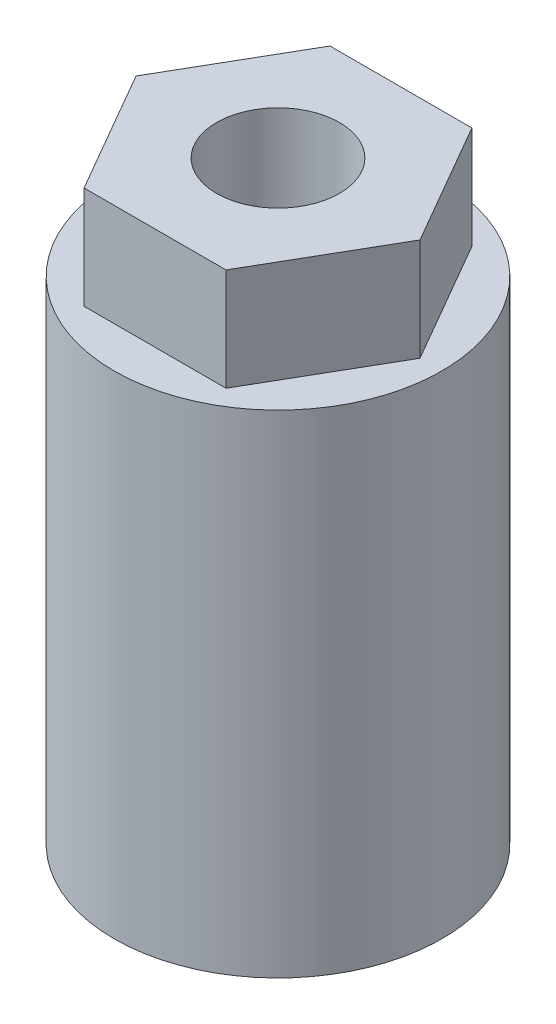
ISO-10303-21;
HEADER;
FILE_DESCRIPTION(('STEP AP214'),'2;1');
FILE_NAME('part.step','',(''),(''),'','','');
FILE_SCHEMA(('AUTOMOTIVE_DESIGN { 1 0 10303 214 1 1 1 1 }'));
ENDSEC;
DATA;
#1=APPLICATION_CONTEXT('core data for automotive mechanical design processes');
#2=APPLICATION_PROTOCOL_DEFINITION('international standard','automotive_design',2000,#1);
#3=PRODUCT_CONTEXT('',#1,'mechanical');
#4=PRODUCT('Part','Part','',(#3));
#5=PRODUCT_RELATED_PRODUCT_CATEGORY('part','',(#4));
#6=PRODUCT_DEFINITION_FORMATION('','',#4);
#7=PRODUCT_DEFINITION_CONTEXT('part definition',#1,'design');
#8=PRODUCT_DEFINITION('design','',#6,#7);
#9=PRODUCT_DEFINITION_SHAPE('','',#8);
#10=(LENGTH_UNIT() NAMED_UNIT(*) SI_UNIT(.MILLI.,.METRE.));
#11=(NAMED_UNIT(*) PLANE_ANGLE_UNIT() SI_UNIT($,.RADIAN.));
#12=(NAMED_UNIT(*) SI_UNIT($,.STERADIAN.) SOLID_ANGLE_UNIT());
#13=UNCERTAINTY_MEASURE_WITH_UNIT(LENGTH_MEASURE(1.E-05),#10,'distance_accuracy_value','');
#14=(GEOMETRIC_REPRESENTATION_CONTEXT(3) GLOBAL_UNCERTAINTY_ASSIGNED_CONTEXT((#13)) GLOBAL_UNIT_ASSIGNED_CONTEXT((#10,
#11,#12)) REPRESENTATION_CONTEXT('',''));
#15=CARTESIAN_POINT('',(0.,0.,0.));
#16=DIRECTION('',(0.,0.,1.));
#17=DIRECTION('',(1.,0.,0.));
#18=AXIS2_PLACEMENT_3D('',#15,#16,#17);
#19=CARTESIAN_POINT('',(0.,0.,0.));
#20=DIRECTION('',(0.,-1.,0.));
#21=DIRECTION('',(0.,0.,-1.));
#22=AXIS2_PLACEMENT_3D('',#19,#20,#21);
#23=CYLINDRICAL_SURFACE('',#22,4.3);
#24=CARTESIAN_POINT('',(0.,0.,0.));
#25=DIRECTION('',(0.,-1.,0.));
#26=DIRECTION('',(0.,0.,-1.));
#27=AXIS2_PLACEMENT_3D('',#24,#25,#26);
#28=CIRCLE('',#27,4.3);
#29=CARTESIAN_POINT('',(3.92778563569857,0.,1.75));
#30=VERTEX_POINT('',#29);
#31=CARTESIAN_POINT('',(3.92778563569857,0.,-1.75));
#32=VERTEX_POINT('',#31);
#33=EDGE_CURVE('E11',#30,#32,#28,.T.);
#34=ORIENTED_EDGE('',*,*,#33,.T.);
#35=DIRECTION('',(0.,-1.,0.));
#36=VECTOR('',#35,1.);
#37=CARTESIAN_POINT('',(3.92778563569857,0.,-1.75));
#38=LINE('',#37,#36);
#39=CARTESIAN_POINT('',(3.92778563569857,12.,-1.75));
#40=VERTEX_POINT('',#39);
#41=EDGE_CURVE('E126',#32,#40,#38,.F.);
#42=ORIENTED_EDGE('',*,*,#41,.T.);
#43=CARTESIAN_POINT('',(0.,12.,0.));
#44=DIRECTION('',(0.,-1.,0.));
#45=DIRECTION('',(0.,0.,-1.));
#46=AXIS2_PLACEMENT_3D('',#43,#44,#45);
#47=CIRCLE('',#46,4.3);
#48=CARTESIAN_POINT('',(3.92778563569857,12.,1.75));
#49=VERTEX_POINT('',#48);
#50=EDGE_CURVE('E205',#49,#40,#47,.T.);
#51=ORIENTED_EDGE('',*,*,#50,.F.);
#52=DIRECTION('',(0.,-1.,0.));
#53=VECTOR('',#52,1.);
#54=CARTESIAN_POINT('',(3.92778563569857,0.,1.75));
#55=LINE('',#54,#53);
#56=EDGE_CURVE('E149',#49,#30,#55,.T.);
#57=ORIENTED_EDGE('',*,*,#56,.T.);
#58=EDGE_LOOP('',(#34,#42,#51,#57));
#59=FACE_BOUND('',#58,.T.);
#60=ADVANCED_FACE('F41',(#59),#23,.F.);
#61=CARTESIAN_POINT('',(0.,0.,0.));
#62=DIRECTION('',(0.,-1.,0.));
#63=DIRECTION('',(0.,0.,-1.));
#64=AXIS2_PLACEMENT_3D('',#61,#62,#63);
#65=PLANE('',#64);
#66=DIRECTION('',(1.,0.,0.));
#67=VECTOR('',#66,1.);
#68=CARTESIAN_POINT('',(2.55,0.,-1.75));
#69=LINE('',#68,#67);
#70=CARTESIAN_POINT('',(6.05,0.,-1.75));
#71=VERTEX_POINT('',#70);
#72=EDGE_CURVE('E122',#32,#71,#69,.T.);
#73=ORIENTED_EDGE('',*,*,#72,.F.);
#74=ORIENTED_EDGE('',*,*,#33,.F.);
#75=DIRECTION('',(-1.,0.,0.));
#76=VECTOR('',#75,1.);
#77=CARTESIAN_POINT('',(2.55,0.,1.75));
#78=LINE('',#77,#76);
#79=CARTESIAN_POINT('',(6.05,0.,1.75));
#80=VERTEX_POINT('',#79);
#81=EDGE_CURVE('E130',#80,#30,#78,.T.);
#82=ORIENTED_EDGE('',*,*,#81,.F.);
#83=DIRECTION('',(0.,0.,1.));
#84=VECTOR('',#83,1.);
#85=CARTESIAN_POINT('',(6.05,0.,-1.75));
#86=LINE('',#85,#84);
#87=EDGE_CURVE('E55',#71,#80,#86,.T.);
#88=ORIENTED_EDGE('',*,*,#87,.F.);
#89=EDGE_LOOP('',(#73,#74,#82,#88));
#90=FACE_BOUND('',#89,.T.);
#91=CARTESIAN_POINT('',(0.,0.,0.));
#92=DIRECTION('',(0.,-1.,0.));
#93=DIRECTION('',(0.,0.,-1.));
#94=AXIS2_PLACEMENT_3D('',#91,#92,#93);
#95=CIRCLE('',#94,8.);
#96=CARTESIAN_POINT('',(0.,0.,-8.));
#97=VERTEX_POINT('',#96);
#98=EDGE_CURVE('E48',#97,#97,#95,.T.);
#99=ORIENTED_EDGE('',*,*,#98,.T.);
#100=EDGE_LOOP('',(#99));
#101=FACE_BOUND('',#100,.T.);
#102=ADVANCED_FACE('F139',(#90,#101),#65,.T.);
#103=CARTESIAN_POINT('',(0.,0.,0.));
#104=DIRECTION('',(0.,-1.,0.));
#105=DIRECTION('',(0.,0.,-1.));
#106=AXIS2_PLACEMENT_3D('',#103,#104,#105);
#107=CYLINDRICAL_SURFACE('',#106,8.);
#108=CARTESIAN_POINT('',(0.,24.,0.));
#109=DIRECTION('',(0.,-1.,0.));
#110=DIRECTION('',(0.,0.,-1.));
#111=AXIS2_PLACEMENT_3D('',#108,#109,#110);
#112=CIRCLE('',#111,8.);
#113=CARTESIAN_POINT('',(0.,24.,-8.));
#114=VERTEX_POINT('',#113);
#115=EDGE_CURVE('E208',#114,#114,#112,.T.);
#116=ORIENTED_EDGE('',*,*,#115,.T.);
#117=EDGE_LOOP('',(#116));
#118=FACE_BOUND('',#117,.T.);
#119=ORIENTED_EDGE('',*,*,#98,.F.);
#120=EDGE_LOOP('',(#119));
#121=FACE_BOUND('',#120,.T.);
#122=ADVANCED_FACE('F213',(#118,#121),#107,.T.);
#123=CARTESIAN_POINT('',(0.,24.,0.));
#124=DIRECTION('',(0.,1.,0.));
#125=DIRECTION('',(0.,0.,1.));
#126=AXIS2_PLACEMENT_3D('',#123,#124,#125);
#127=PLANE('',#126);
#128=DIRECTION('',(0.5,0.,-0.866025403784439));
#129=VECTOR('',#128,1.);
#130=CARTESIAN_POINT('',(3.46410161513775,24.,6.));
#131=LINE('',#130,#129);
#132=CARTESIAN_POINT('',(3.46410161513775,24.,6.));
#133=VERTEX_POINT('',#132);
#134=CARTESIAN_POINT('',(6.92820323027551,24.,0.));
#135=VERTEX_POINT('',#134);
#136=EDGE_CURVE('E63',#133,#135,#131,.T.);
#137=ORIENTED_EDGE('',*,*,#136,.F.);
#138=DIRECTION('',(1.,0.,0.));
#139=VECTOR('',#138,1.);
#140=CARTESIAN_POINT('',(-3.46410161513775,24.,6.));
#141=LINE('',#140,#139);
#142=CARTESIAN_POINT('',(-3.46410161513775,24.,6.));
#143=VERTEX_POINT('',#142);
#144=EDGE_CURVE('E163',#143,#133,#141,.T.);
#145=ORIENTED_EDGE('',*,*,#144,.F.);
#146=DIRECTION('',(0.5,0.,0.866025403784439));
#147=VECTOR('',#146,1.);
#148=CARTESIAN_POINT('',(-6.92820323027551,24.,0.));
#149=LINE('',#148,#147);
#150=CARTESIAN_POINT('',(-6.92820323027551,24.,0.));
#151=VERTEX_POINT('',#150);
#152=EDGE_CURVE('E184',#151,#143,#149,.T.);
#153=ORIENTED_EDGE('',*,*,#152,.F.);
#154=DIRECTION('',(-0.5,0.,0.866025403784439));
#155=VECTOR('',#154,1.);
#156=CARTESIAN_POINT('',(-3.46410161513775,24.,-6.));
#157=LINE('',#156,#155);
#158=CARTESIAN_POINT('',(-3.46410161513775,24.,-6.));
#159=VERTEX_POINT('',#158);
#160=EDGE_CURVE('E181',#159,#151,#157,.T.);
#161=ORIENTED_EDGE('',*,*,#160,.F.);
#162=DIRECTION('',(-1.,0.,0.));
#163=VECTOR('',#162,1.);
#164=CARTESIAN_POINT('',(3.46410161513775,24.,-6.));
#165=LINE('',#164,#163);
#166=CARTESIAN_POINT('',(3.46410161513775,24.,-6.));
#167=VERTEX_POINT('',#166);
#168=EDGE_CURVE('E178',#167,#159,#165,.T.);
#169=ORIENTED_EDGE('',*,*,#168,.F.);
#170=DIRECTION('',(-0.5,0.,-0.866025403784439));
#171=VECTOR('',#170,1.);
#172=CARTESIAN_POINT('',(6.92820323027551,24.,0.));
#173=LINE('',#172,#171);
#174=EDGE_CURVE('E175',#135,#167,#173,.T.);
#175=ORIENTED_EDGE('',*,*,#174,.F.);
#176=EDGE_LOOP('',(#137,#145,#153,#161,#169,#175));
#177=FACE_BOUND('',#176,.T.);
#178=ORIENTED_EDGE('',*,*,#115,.F.);
#179=EDGE_LOOP('',(#178));
#180=FACE_BOUND('',#179,.T.);
#181=ADVANCED_FACE('F215',(#177,#180),#127,.T.);
#182=CARTESIAN_POINT('',(0.,12.,0.));
#183=DIRECTION('',(0.,-1.,0.));
#184=DIRECTION('',(0.,0.,-1.));
#185=AXIS2_PLACEMENT_3D('',#182,#183,#184);
#186=PLANE('',#185);
#187=ORIENTED_EDGE('',*,*,#50,.T.);
#188=DIRECTION('',(-1.,0.,0.));
#189=VECTOR('',#188,1.);
#190=CARTESIAN_POINT('',(2.55,12.,-1.75));
#191=LINE('',#190,#189);
#192=CARTESIAN_POINT('',(6.05,12.,-1.75));
#193=VERTEX_POINT('',#192);
#194=EDGE_CURVE('E136',#193,#40,#191,.T.);
#195=ORIENTED_EDGE('',*,*,#194,.F.);
#196=DIRECTION('',(0.,0.,-1.));
#197=VECTOR('',#196,1.);
#198=CARTESIAN_POINT('',(6.05,12.,-1.75));
#199=LINE('',#198,#197);
#200=CARTESIAN_POINT('',(6.05,12.,1.75));
#201=VERTEX_POINT('',#200);
#202=EDGE_CURVE('E134',#201,#193,#199,.T.);
#203=ORIENTED_EDGE('',*,*,#202,.F.);
#204=DIRECTION('',(1.,0.,0.));
#205=VECTOR('',#204,1.);
#206=CARTESIAN_POINT('',(2.55,12.,1.75));
#207=LINE('',#206,#205);
#208=EDGE_CURVE('E147',#49,#201,#207,.T.);
#209=ORIENTED_EDGE('',*,*,#208,.F.);
#210=EDGE_LOOP('',(#187,#195,#203,#209));
#211=FACE_BOUND('',#210,.T.);
#212=ADVANCED_FACE('F222',(#211),#186,.T.);
#213=CARTESIAN_POINT('',(3.46410161513775,29.,6.));
#214=DIRECTION('',(-0.866025403784439,0.,-0.5));
#215=DIRECTION('',(-0.5,0.,0.866025403784439));
#216=AXIS2_PLACEMENT_3D('',#213,#214,#215);
#217=PLANE('',#216);
#218=ORIENTED_EDGE('',*,*,#136,.T.);
#219=DIRECTION('',(0.,-1.,0.));
#220=VECTOR('',#219,1.);
#221=CARTESIAN_POINT('',(6.92820323027551,29.,0.));
#222=LINE('',#221,#220);
#223=CARTESIAN_POINT('',(6.92820323027551,29.,0.));
#224=VERTEX_POINT('',#223);
#225=EDGE_CURVE('E202',#224,#135,#222,.T.);
#226=ORIENTED_EDGE('',*,*,#225,.F.);
#227=DIRECTION('',(0.5,0.,-0.866025403784439));
#228=VECTOR('',#227,1.);
#229=CARTESIAN_POINT('',(3.46410161513775,29.,6.));
#230=LINE('',#229,#228);
#231=CARTESIAN_POINT('',(3.46410161513775,29.,6.));
#232=VERTEX_POINT('',#231);
#233=EDGE_CURVE('E159',#232,#224,#230,.T.);
#234=ORIENTED_EDGE('',*,*,#233,.F.);
#235=DIRECTION('',(0.,-1.,0.));
#236=VECTOR('',#235,1.);
#237=CARTESIAN_POINT('',(3.46410161513775,29.,6.));
#238=LINE('',#237,#236);
#239=EDGE_CURVE('E173',#232,#133,#238,.T.);
#240=ORIENTED_EDGE('',*,*,#239,.T.);
#241=EDGE_LOOP('',(#218,#226,#234,#240));
#242=FACE_BOUND('',#241,.T.);
#243=ADVANCED_FACE('F234',(#242),#217,.F.);
#244=CARTESIAN_POINT('',(6.92820323027551,29.,0.));
#245=DIRECTION('',(-0.866025403784439,0.,0.5));
#246=DIRECTION('',(0.5,0.,0.866025403784439));
#247=AXIS2_PLACEMENT_3D('',#244,#245,#246);
#248=PLANE('',#247);
#249=ORIENTED_EDGE('',*,*,#174,.T.);
#250=DIRECTION('',(0.,-1.,0.));
#251=VECTOR('',#250,1.);
#252=CARTESIAN_POINT('',(3.46410161513775,29.,-6.));
#253=LINE('',#252,#251);
#254=CARTESIAN_POINT('',(3.46410161513775,29.,-6.));
#255=VERTEX_POINT('',#254);
#256=EDGE_CURVE('E199',#255,#167,#253,.T.);
#257=ORIENTED_EDGE('',*,*,#256,.F.);
#258=DIRECTION('',(-0.5,0.,-0.866025403784439));
#259=VECTOR('',#258,1.);
#260=CARTESIAN_POINT('',(6.92820323027551,29.,0.));
#261=LINE('',#260,#259);
#262=EDGE_CURVE('E162',#224,#255,#261,.T.);
#263=ORIENTED_EDGE('',*,*,#262,.F.);
#264=ORIENTED_EDGE('',*,*,#225,.T.);
#265=EDGE_LOOP('',(#249,#257,#263,#264));
#266=FACE_BOUND('',#265,.T.);
#267=ADVANCED_FACE('F239',(#266),#248,.F.);
#268=CARTESIAN_POINT('',(3.46410161513775,29.,-6.));
#269=DIRECTION('',(0.,0.,1.));
#270=DIRECTION('',(1.,0.,0.));
#271=AXIS2_PLACEMENT_3D('',#268,#269,#270);
#272=PLANE('',#271);
#273=ORIENTED_EDGE('',*,*,#168,.T.);
#274=DIRECTION('',(0.,-1.,0.));
#275=VECTOR('',#274,1.);
#276=CARTESIAN_POINT('',(-3.46410161513775,29.,-6.));
#277=LINE('',#276,#275);
#278=CARTESIAN_POINT('',(-3.46410161513775,29.,-6.));
#279=VERTEX_POINT('',#278);
#280=EDGE_CURVE('E196',#279,#159,#277,.T.);
#281=ORIENTED_EDGE('',*,*,#280,.F.);
#282=DIRECTION('',(-1.,0.,0.));
#283=VECTOR('',#282,1.);
#284=CARTESIAN_POINT('',(3.46410161513775,29.,-6.));
#285=LINE('',#284,#283);
#286=EDGE_CURVE('E165',#255,#279,#285,.T.);
#287=ORIENTED_EDGE('',*,*,#286,.F.);
#288=ORIENTED_EDGE('',*,*,#256,.T.);
#289=EDGE_LOOP('',(#273,#281,#287,#288));
#290=FACE_BOUND('',#289,.T.);
#291=ADVANCED_FACE('F245',(#290),#272,.F.);
#292=CARTESIAN_POINT('',(-3.46410161513775,29.,-6.));
#293=DIRECTION('',(0.866025403784439,0.,0.5));
#294=DIRECTION('',(0.5,0.,-0.866025403784439));
#295=AXIS2_PLACEMENT_3D('',#292,#293,#294);
#296=PLANE('',#295);
#297=ORIENTED_EDGE('',*,*,#160,.T.);
#298=DIRECTION('',(0.,-1.,0.));
#299=VECTOR('',#298,1.);
#300=CARTESIAN_POINT('',(-6.92820323027551,29.,0.));
#301=LINE('',#300,#299);
#302=CARTESIAN_POINT('',(-6.92820323027551,29.,0.));
#303=VERTEX_POINT('',#302);
#304=EDGE_CURVE('E193',#303,#151,#301,.T.);
#305=ORIENTED_EDGE('',*,*,#304,.F.);
#306=DIRECTION('',(-0.5,0.,0.866025403784439));
#307=VECTOR('',#306,1.);
#308=CARTESIAN_POINT('',(-3.46410161513775,29.,-6.));
#309=LINE('',#308,#307);
#310=EDGE_CURVE('E167',#279,#303,#309,.T.);
#311=ORIENTED_EDGE('',*,*,#310,.F.);
#312=ORIENTED_EDGE('',*,*,#280,.T.);
#313=EDGE_LOOP('',(#297,#305,#311,#312));
#314=FACE_BOUND('',#313,.T.);
#315=ADVANCED_FACE('F249',(#314),#296,.F.);
#316=CARTESIAN_POINT('',(-6.92820323027551,29.,0.));
#317=DIRECTION('',(0.866025403784439,0.,-0.5));
#318=DIRECTION('',(-0.5,0.,-0.866025403784439));
#319=AXIS2_PLACEMENT_3D('',#316,#317,#318);
#320=PLANE('',#319);
#321=ORIENTED_EDGE('',*,*,#152,.T.);
#322=DIRECTION('',(0.,-1.,0.));
#323=VECTOR('',#322,1.);
#324=CARTESIAN_POINT('',(-3.46410161513775,29.,6.));
#325=LINE('',#324,#323);
#326=CARTESIAN_POINT('',(-3.46410161513775,29.,6.));
#327=VERTEX_POINT('',#326);
#328=EDGE_CURVE('E190',#327,#143,#325,.T.);
#329=ORIENTED_EDGE('',*,*,#328,.F.);
#330=DIRECTION('',(0.5,0.,0.866025403784439));
#331=VECTOR('',#330,1.);
#332=CARTESIAN_POINT('',(-6.92820323027551,29.,0.));
#333=LINE('',#332,#331);
#334=EDGE_CURVE('E169',#303,#327,#333,.T.);
#335=ORIENTED_EDGE('',*,*,#334,.F.);
#336=ORIENTED_EDGE('',*,*,#304,.T.);
#337=EDGE_LOOP('',(#321,#329,#335,#336));
#338=FACE_BOUND('',#337,.T.);
#339=ADVANCED_FACE('F253',(#338),#320,.F.);
#340=CARTESIAN_POINT('',(-3.46410161513775,29.,6.));
#341=DIRECTION('',(0.,0.,-1.));
#342=DIRECTION('',(-1.,0.,0.));
#343=AXIS2_PLACEMENT_3D('',#340,#341,#342);
#344=PLANE('',#343);
#345=ORIENTED_EDGE('',*,*,#144,.T.);
#346=ORIENTED_EDGE('',*,*,#239,.F.);
#347=DIRECTION('',(1.,0.,0.));
#348=VECTOR('',#347,1.);
#349=CARTESIAN_POINT('',(-3.46410161513775,29.,6.));
#350=LINE('',#349,#348);
#351=EDGE_CURVE('E171',#327,#232,#350,.T.);
#352=ORIENTED_EDGE('',*,*,#351,.F.);
#353=ORIENTED_EDGE('',*,*,#328,.T.);
#354=EDGE_LOOP('',(#345,#346,#352,#353));
#355=FACE_BOUND('',#354,.T.);
#356=ADVANCED_FACE('F257',(#355),#344,.F.);
#357=CARTESIAN_POINT('',(0.,29.,0.));
#358=DIRECTION('',(0.,1.,0.));
#359=DIRECTION('',(0.,0.,1.));
#360=AXIS2_PLACEMENT_3D('',#357,#358,#359);
#361=PLANE('',#360);
#362=CARTESIAN_POINT('',(0.,29.,0.));
#363=DIRECTION('',(0.,1.,0.));
#364=DIRECTION('',(0.,0.,1.));
#365=AXIS2_PLACEMENT_3D('',#362,#363,#364);
#366=CIRCLE('',#365,3.);
#367=CARTESIAN_POINT('',(0.,29.,3.));
#368=VERTEX_POINT('',#367);
#369=EDGE_CURVE('E153',#368,#368,#366,.T.);
#370=ORIENTED_EDGE('',*,*,#369,.F.);
#371=EDGE_LOOP('',(#370));
#372=FACE_BOUND('',#371,.T.);
#373=ORIENTED_EDGE('',*,*,#233,.T.);
#374=ORIENTED_EDGE('',*,*,#262,.T.);
#375=ORIENTED_EDGE('',*,*,#286,.T.);
#376=ORIENTED_EDGE('',*,*,#310,.T.);
#377=ORIENTED_EDGE('',*,*,#334,.T.);
#378=ORIENTED_EDGE('',*,*,#351,.T.);
#379=EDGE_LOOP('',(#373,#374,#375,#376,#377,#378));
#380=FACE_BOUND('',#379,.T.);
#381=ADVANCED_FACE('F261',(#372,#380),#361,.T.);
#382=CARTESIAN_POINT('',(0.,19.,0.));
#383=DIRECTION('',(0.,1.,0.));
#384=DIRECTION('',(0.,0.,1.));
#385=AXIS2_PLACEMENT_3D('',#382,#383,#384);
#386=CONICAL_SURFACE('',#385,3.,1.02974425867665);
#387=CARTESIAN_POINT('',(0.,17.1974181429173,0.));
#388=VERTEX_POINT('',#387);
#389=VERTEX_LOOP('',#388);
#390=FACE_BOUND('',#389,.T.);
#391=CARTESIAN_POINT('',(0.,19.,0.));
#392=DIRECTION('',(0.,1.,0.));
#393=DIRECTION('',(0.,0.,1.));
#394=AXIS2_PLACEMENT_3D('',#391,#392,#393);
#395=CIRCLE('',#394,3.);
#396=CARTESIAN_POINT('',(0.,19.,3.));
#397=VERTEX_POINT('',#396);
#398=EDGE_CURVE('E156',#397,#397,#395,.T.);
#399=ORIENTED_EDGE('',*,*,#398,.T.);
#400=EDGE_LOOP('',(#399));
#401=FACE_BOUND('',#400,.T.);
#402=ADVANCED_FACE('F265',(#390,#401),#386,.F.);
#403=CARTESIAN_POINT('',(0.,29.,0.));
#404=DIRECTION('',(0.,1.,0.));
#405=DIRECTION('',(0.,0.,1.));
#406=AXIS2_PLACEMENT_3D('',#403,#404,#405);
#407=CYLINDRICAL_SURFACE('',#406,3.);
#408=ORIENTED_EDGE('',*,*,#398,.F.);
#409=EDGE_LOOP('',(#408));
#410=FACE_BOUND('',#409,.T.);
#411=ORIENTED_EDGE('',*,*,#369,.T.);
#412=EDGE_LOOP('',(#411));
#413=FACE_BOUND('',#412,.T.);
#414=ADVANCED_FACE('F269',(#410,#413),#407,.F.);
#415=CARTESIAN_POINT('',(2.55,16.9497474683058,-1.75));
#416=DIRECTION('',(0.,0.,-1.));
#417=DIRECTION('',(-1.,0.,0.));
#418=AXIS2_PLACEMENT_3D('',#415,#416,#417);
#419=PLANE('',#418);
#420=ORIENTED_EDGE('',*,*,#72,.T.);
#421=DIRECTION('',(0.,-1.,0.));
#422=VECTOR('',#421,1.);
#423=CARTESIAN_POINT('',(6.05,16.9497474683058,-1.75));
#424=LINE('',#423,#422);
#425=EDGE_CURVE('E124',#193,#71,#424,.T.);
#426=ORIENTED_EDGE('',*,*,#425,.F.);
#427=ORIENTED_EDGE('',*,*,#194,.T.);
#428=ORIENTED_EDGE('',*,*,#41,.F.);
#429=EDGE_LOOP('',(#420,#426,#427,#428));
#430=FACE_BOUND('',#429,.T.);
#431=ADVANCED_FACE('F123',(#430),#419,.F.);
#432=CARTESIAN_POINT('',(2.55,16.9497474683058,1.75));
#433=DIRECTION('',(0.,0.,1.));
#434=DIRECTION('',(1.,0.,0.));
#435=AXIS2_PLACEMENT_3D('',#432,#433,#434);
#436=PLANE('',#435);
#437=ORIENTED_EDGE('',*,*,#208,.T.);
#438=DIRECTION('',(0.,-1.,0.));
#439=VECTOR('',#438,1.);
#440=CARTESIAN_POINT('',(6.05,16.9497474683058,1.75));
#441=LINE('',#440,#439);
#442=EDGE_CURVE('E129',#201,#80,#441,.T.);
#443=ORIENTED_EDGE('',*,*,#442,.T.);
#444=ORIENTED_EDGE('',*,*,#81,.T.);
#445=ORIENTED_EDGE('',*,*,#56,.F.);
#446=EDGE_LOOP('',(#437,#443,#444,#445));
#447=FACE_BOUND('',#446,.T.);
#448=ADVANCED_FACE('F231',(#447),#436,.F.);
#449=CARTESIAN_POINT('',(6.05,16.9497474683058,-1.75));
#450=DIRECTION('',(1.,0.,0.));
#451=DIRECTION('',(0.,0.,-1.));
#452=AXIS2_PLACEMENT_3D('',#449,#450,#451);
#453=PLANE('',#452);
#454=ORIENTED_EDGE('',*,*,#202,.T.);
#455=ORIENTED_EDGE('',*,*,#425,.T.);
#456=ORIENTED_EDGE('',*,*,#87,.T.);
#457=ORIENTED_EDGE('',*,*,#442,.F.);
#458=EDGE_LOOP('',(#454,#455,#456,#457));
#459=FACE_BOUND('',#458,.T.);
#460=ADVANCED_FACE('F132',(#459),#453,.F.);
#461=CLOSED_SHELL('',(#60,#102,#122,#181,#212,#243,#267,#291,#315,#339,#356,#381,#402,#414,#431,
#448,#460));
#462=MANIFOLD_SOLID_BREP('B2',#461);
#463=ADVANCED_BREP_SHAPE_REPRESENTATION('',(#18,#462),#14);
#464=SHAPE_DEFINITION_REPRESENTATION(#9,#463);
ENDSEC;
END-ISO-10303-21;
